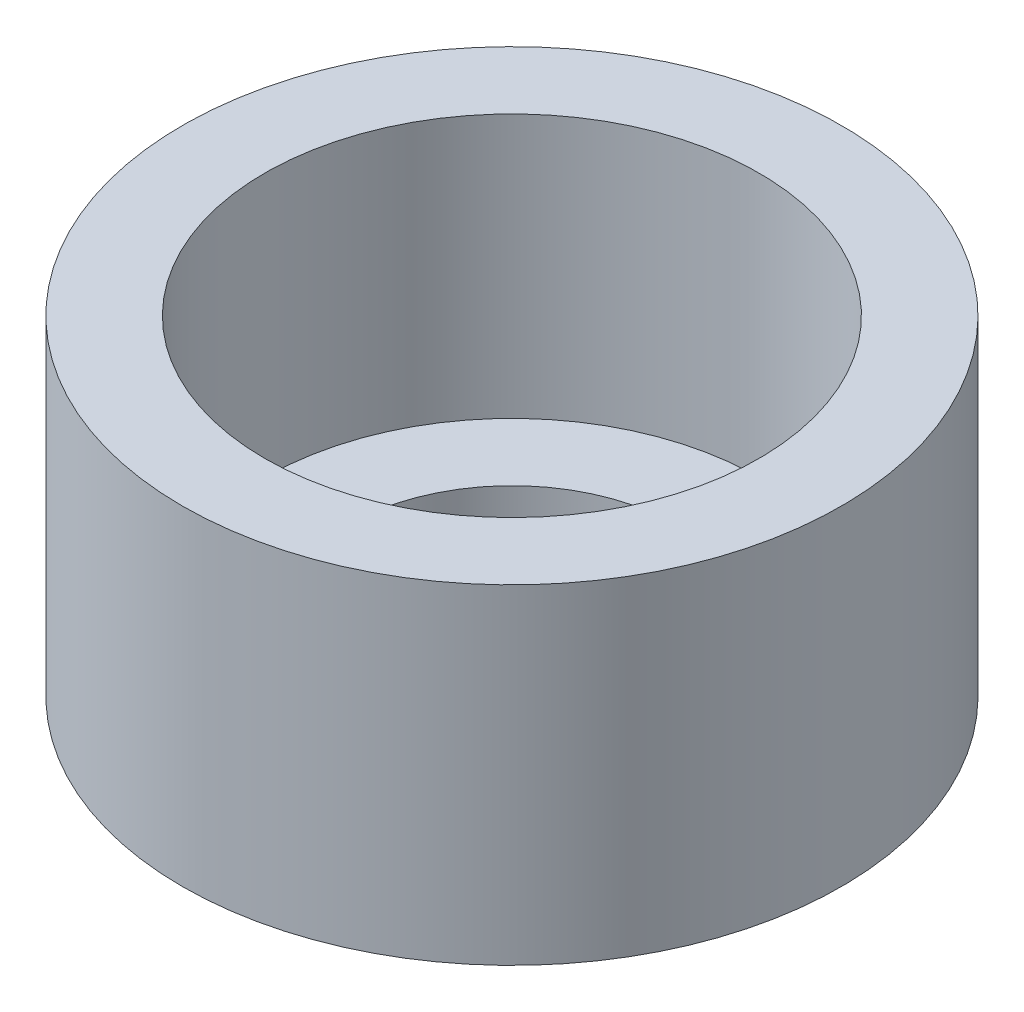
ISO-10303-21;
HEADER;
FILE_DESCRIPTION(('STEP AP214'),'2;1');
FILE_NAME('part.step','',(''),(''),'','','');
FILE_SCHEMA(('AUTOMOTIVE_DESIGN { 1 0 10303 214 1 1 1 1 }'));
ENDSEC;
DATA;
#1=APPLICATION_CONTEXT('core data for automotive mechanical design processes');
#2=APPLICATION_PROTOCOL_DEFINITION('international standard','automotive_design',2000,#1);
#3=PRODUCT_CONTEXT('',#1,'mechanical');
#4=PRODUCT('Part','Part','',(#3));
#5=PRODUCT_RELATED_PRODUCT_CATEGORY('part','',(#4));
#6=PRODUCT_DEFINITION_FORMATION('','',#4);
#7=PRODUCT_DEFINITION_CONTEXT('part definition',#1,'design');
#8=PRODUCT_DEFINITION('design','',#6,#7);
#9=PRODUCT_DEFINITION_SHAPE('','',#8);
#10=(LENGTH_UNIT() NAMED_UNIT(*) SI_UNIT(.MILLI.,.METRE.));
#11=(NAMED_UNIT(*) PLANE_ANGLE_UNIT() SI_UNIT($,.RADIAN.));
#12=(NAMED_UNIT(*) SI_UNIT($,.STERADIAN.) SOLID_ANGLE_UNIT());
#13=UNCERTAINTY_MEASURE_WITH_UNIT(LENGTH_MEASURE(1.E-05),#10,'distance_accuracy_value','');
#14=(GEOMETRIC_REPRESENTATION_CONTEXT(3) GLOBAL_UNCERTAINTY_ASSIGNED_CONTEXT((#13)) GLOBAL_UNIT_ASSIGNED_CONTEXT((#10,
#11,#12)) REPRESENTATION_CONTEXT('',''));
#15=CARTESIAN_POINT('',(0.,0.,0.));
#16=DIRECTION('',(0.,0.,1.));
#17=DIRECTION('',(1.,0.,0.));
#18=AXIS2_PLACEMENT_3D('',#15,#16,#17);
#19=CARTESIAN_POINT('',(0.,10.,0.));
#20=DIRECTION('',(0.,-1.,0.));
#21=DIRECTION('',(0.,0.,-1.));
#22=AXIS2_PLACEMENT_3D('',#19,#20,#21);
#23=CYLINDRICAL_SURFACE('',#22,5.);
#24=CARTESIAN_POINT('',(0.,0.,0.));
#25=DIRECTION('',(0.,1.,0.));
#26=DIRECTION('',(0.,0.,1.));
#27=AXIS2_PLACEMENT_3D('',#24,#25,#26);
#28=CIRCLE('',#27,5.);
#29=CARTESIAN_POINT('',(0.,0.,5.));
#30=VERTEX_POINT('',#29);
#31=EDGE_CURVE('E46',#30,#30,#28,.T.);
#32=ORIENTED_EDGE('',*,*,#31,.F.);
#33=EDGE_LOOP('',(#32));
#34=FACE_BOUND('',#33,.T.);
#35=CARTESIAN_POINT('',(0.,2.,0.));
#36=DIRECTION('',(0.,1.,0.));
#37=DIRECTION('',(0.,0.,1.));
#38=AXIS2_PLACEMENT_3D('',#35,#36,#37);
#39=CIRCLE('',#38,5.);
#40=CARTESIAN_POINT('',(0.,2.,5.));
#41=VERTEX_POINT('',#40);
#42=EDGE_CURVE('E37',#41,#41,#39,.T.);
#43=ORIENTED_EDGE('',*,*,#42,.T.);
#44=EDGE_LOOP('',(#43));
#45=FACE_BOUND('',#44,.T.);
#46=ADVANCED_FACE('F33',(#34,#45),#23,.F.);
#47=CARTESIAN_POINT('',(0.,10.,0.));
#48=DIRECTION('',(0.,1.,0.));
#49=DIRECTION('',(0.,0.,1.));
#50=AXIS2_PLACEMENT_3D('',#47,#48,#49);
#51=PLANE('',#50);
#52=CARTESIAN_POINT('',(0.,10.,0.));
#53=DIRECTION('',(0.,1.,0.));
#54=DIRECTION('',(0.,0.,1.));
#55=AXIS2_PLACEMENT_3D('',#52,#53,#54);
#56=CIRCLE('',#55,7.5);
#57=CARTESIAN_POINT('',(0.,10.,7.5));
#58=VERTEX_POINT('',#57);
#59=EDGE_CURVE('E50',#58,#58,#56,.T.);
#60=ORIENTED_EDGE('',*,*,#59,.F.);
#61=EDGE_LOOP('',(#60));
#62=FACE_BOUND('',#61,.T.);
#63=CARTESIAN_POINT('',(0.,10.,0.));
#64=DIRECTION('',(0.,1.,0.));
#65=DIRECTION('',(0.,0.,1.));
#66=AXIS2_PLACEMENT_3D('',#63,#64,#65);
#67=CIRCLE('',#66,10.);
#68=CARTESIAN_POINT('',(0.,10.,10.));
#69=VERTEX_POINT('',#68);
#70=EDGE_CURVE('E10',#69,#69,#67,.T.);
#71=ORIENTED_EDGE('',*,*,#70,.T.);
#72=EDGE_LOOP('',(#71));
#73=FACE_BOUND('',#72,.T.);
#74=ADVANCED_FACE('F71',(#62,#73),#51,.T.);
#75=CARTESIAN_POINT('',(0.,0.,0.));
#76=DIRECTION('',(0.,1.,0.));
#77=DIRECTION('',(0.,0.,1.));
#78=AXIS2_PLACEMENT_3D('',#75,#76,#77);
#79=PLANE('',#78);
#80=CARTESIAN_POINT('',(0.,0.,0.));
#81=DIRECTION('',(0.,1.,0.));
#82=DIRECTION('',(0.,0.,1.));
#83=AXIS2_PLACEMENT_3D('',#80,#81,#82);
#84=CIRCLE('',#83,10.);
#85=CARTESIAN_POINT('',(0.,0.,10.));
#86=VERTEX_POINT('',#85);
#87=EDGE_CURVE('E41',#86,#86,#84,.T.);
#88=ORIENTED_EDGE('',*,*,#87,.F.);
#89=EDGE_LOOP('',(#88));
#90=FACE_BOUND('',#89,.T.);
#91=ORIENTED_EDGE('',*,*,#31,.T.);
#92=EDGE_LOOP('',(#91));
#93=FACE_BOUND('',#92,.T.);
#94=ADVANCED_FACE('F77',(#90,#93),#79,.F.);
#95=CARTESIAN_POINT('',(0.,10.,0.));
#96=DIRECTION('',(0.,-1.,0.));
#97=DIRECTION('',(0.,0.,-1.));
#98=AXIS2_PLACEMENT_3D('',#95,#96,#97);
#99=CYLINDRICAL_SURFACE('',#98,10.);
#100=ORIENTED_EDGE('',*,*,#70,.F.);
#101=EDGE_LOOP('',(#100));
#102=FACE_BOUND('',#101,.T.);
#103=ORIENTED_EDGE('',*,*,#87,.T.);
#104=EDGE_LOOP('',(#103));
#105=FACE_BOUND('',#104,.T.);
#106=ADVANCED_FACE('F35',(#102,#105),#99,.T.);
#107=CARTESIAN_POINT('',(0.,2.,0.));
#108=DIRECTION('',(0.,1.,0.));
#109=DIRECTION('',(0.,0.,1.));
#110=AXIS2_PLACEMENT_3D('',#107,#108,#109);
#111=CYLINDRICAL_SURFACE('',#110,7.5);
#112=CARTESIAN_POINT('',(0.,2.,0.));
#113=DIRECTION('',(0.,1.,0.));
#114=DIRECTION('',(0.,0.,1.));
#115=AXIS2_PLACEMENT_3D('',#112,#113,#114);
#116=CIRCLE('',#115,7.5);
#117=CARTESIAN_POINT('',(0.,2.,7.5));
#118=VERTEX_POINT('',#117);
#119=EDGE_CURVE('E53',#118,#118,#116,.T.);
#120=ORIENTED_EDGE('',*,*,#119,.F.);
#121=EDGE_LOOP('',(#120));
#122=FACE_BOUND('',#121,.T.);
#123=ORIENTED_EDGE('',*,*,#59,.T.);
#124=EDGE_LOOP('',(#123));
#125=FACE_BOUND('',#124,.T.);
#126=ADVANCED_FACE('F63',(#122,#125),#111,.F.);
#127=CARTESIAN_POINT('',(0.,2.,0.));
#128=DIRECTION('',(0.,1.,0.));
#129=DIRECTION('',(0.,0.,1.));
#130=AXIS2_PLACEMENT_3D('',#127,#128,#129);
#131=PLANE('',#130);
#132=ORIENTED_EDGE('',*,*,#42,.F.);
#133=EDGE_LOOP('',(#132));
#134=FACE_BOUND('',#133,.T.);
#135=ORIENTED_EDGE('',*,*,#119,.T.);
#136=EDGE_LOOP('',(#135));
#137=FACE_BOUND('',#136,.T.);
#138=ADVANCED_FACE('F61',(#134,#137),#131,.T.);
#139=CLOSED_SHELL('',(#46,#74,#94,#106,#126,#138));
#140=MANIFOLD_SOLID_BREP('B2',#139);
#141=ADVANCED_BREP_SHAPE_REPRESENTATION('',(#18,#140),#14);
#142=SHAPE_DEFINITION_REPRESENTATION(#9,#141);
ENDSEC;
END-ISO-10303-21;
